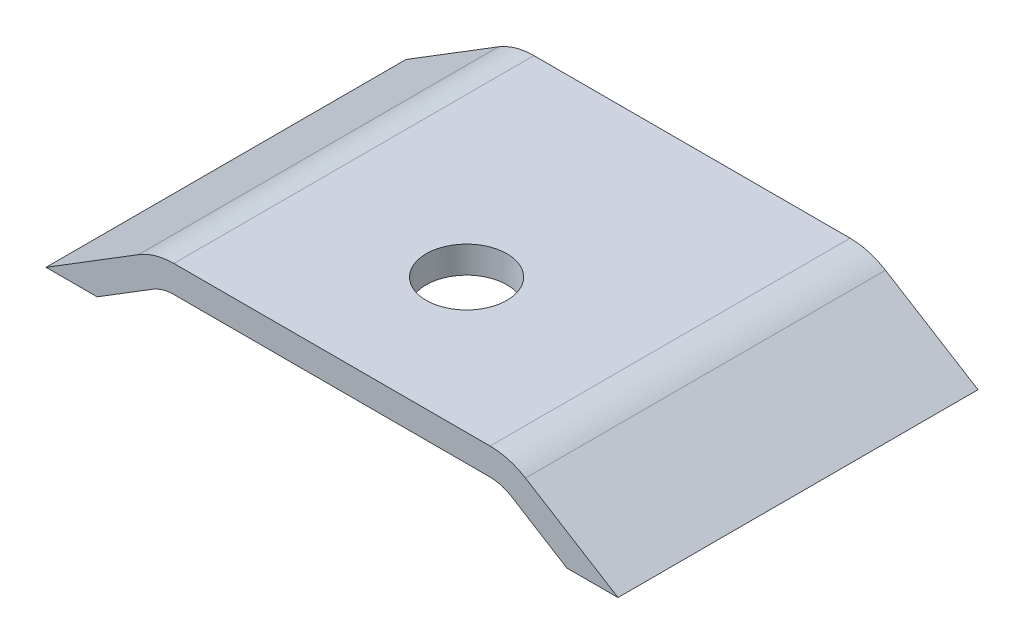
ISO-10303-21;
HEADER;
FILE_DESCRIPTION(('STEP AP214'),'2;1');
FILE_NAME('part.step','',(''),(''),'','','');
FILE_SCHEMA(('AUTOMOTIVE_DESIGN { 1 0 10303 214 1 1 1 1 }'));
ENDSEC;
DATA;
#1=APPLICATION_CONTEXT('core data for automotive mechanical design processes');
#2=APPLICATION_PROTOCOL_DEFINITION('international standard','automotive_design',2000,#1);
#3=PRODUCT_CONTEXT('',#1,'mechanical');
#4=PRODUCT('Part','Part','',(#3));
#5=PRODUCT_RELATED_PRODUCT_CATEGORY('part','',(#4));
#6=PRODUCT_DEFINITION_FORMATION('','',#4);
#7=PRODUCT_DEFINITION_CONTEXT('part definition',#1,'design');
#8=PRODUCT_DEFINITION('design','',#6,#7);
#9=PRODUCT_DEFINITION_SHAPE('','',#8);
#10=(LENGTH_UNIT() NAMED_UNIT(*) SI_UNIT(.MILLI.,.METRE.));
#11=(NAMED_UNIT(*) PLANE_ANGLE_UNIT() SI_UNIT($,.RADIAN.));
#12=(NAMED_UNIT(*) SI_UNIT($,.STERADIAN.) SOLID_ANGLE_UNIT());
#13=UNCERTAINTY_MEASURE_WITH_UNIT(LENGTH_MEASURE(1.E-05),#10,'distance_accuracy_value','');
#14=(GEOMETRIC_REPRESENTATION_CONTEXT(3) GLOBAL_UNCERTAINTY_ASSIGNED_CONTEXT((#13)) GLOBAL_UNIT_ASSIGNED_CONTEXT((#10,
#11,#12)) REPRESENTATION_CONTEXT('',''));
#15=CARTESIAN_POINT('',(0.,0.,0.));
#16=DIRECTION('',(0.,0.,1.));
#17=DIRECTION('',(1.,0.,0.));
#18=AXIS2_PLACEMENT_3D('',#15,#16,#17);
#19=CARTESIAN_POINT('',(53.975,-6.34999999999999,67.945));
#20=DIRECTION('',(0.,1.,0.));
#21=DIRECTION('',(-1.,0.,0.));
#22=AXIS2_PLACEMENT_3D('',#19,#20,#21);
#23=PLANE('',#22);
#24=DIRECTION('',(1.,0.,0.));
#25=VECTOR('',#24,1.);
#26=CARTESIAN_POINT('',(53.975,-6.34999999999999,67.945));
#27=LINE('',#26,#25);
#28=CARTESIAN_POINT('',(44.3202396465514,-6.34999999999999,67.945));
#29=VERTEX_POINT('',#28);
#30=CARTESIAN_POINT('',(53.975,-6.34999999999999,67.945));
#31=VERTEX_POINT('',#30);
#32=EDGE_CURVE('E155',#29,#31,#27,.T.);
#33=ORIENTED_EDGE('',*,*,#32,.F.);
#34=DIRECTION('',(0.,0.,1.));
#35=VECTOR('',#34,1.);
#36=CARTESIAN_POINT('',(44.3202396465514,-6.35,-0.001000000000001));
#37=LINE('',#36,#35);
#38=CARTESIAN_POINT('',(44.3202396465514,-6.35000000000001,0.));
#39=VERTEX_POINT('',#38);
#40=EDGE_CURVE('E146',#39,#29,#37,.T.);
#41=ORIENTED_EDGE('',*,*,#40,.F.);
#42=DIRECTION('',(1.,0.,0.));
#43=VECTOR('',#42,1.);
#44=CARTESIAN_POINT('',(53.975,-6.34999999999999,0.));
#45=LINE('',#44,#43);
#46=CARTESIAN_POINT('',(53.975,-6.34999999999999,0.));
#47=VERTEX_POINT('',#46);
#48=EDGE_CURVE('E170',#39,#47,#45,.T.);
#49=ORIENTED_EDGE('',*,*,#48,.T.);
#50=DIRECTION('',(0.,0.,-1.));
#51=VECTOR('',#50,1.);
#52=CARTESIAN_POINT('',(53.975,-6.34999999999999,67.945));
#53=LINE('',#52,#51);
#54=EDGE_CURVE('E177',#31,#47,#53,.T.);
#55=ORIENTED_EDGE('',*,*,#54,.F.);
#56=EDGE_LOOP('',(#33,#41,#49,#55));
#57=FACE_BOUND('',#56,.T.);
#58=ADVANCED_FACE('F36',(#57),#23,.F.);
#59=CARTESIAN_POINT('',(-53.975,-6.35000000000001,0.));
#60=VERTEX_POINT('',#59);
#61=CARTESIAN_POINT('',(-44.3202396465514,-6.35000000000001,0.));
#62=VERTEX_POINT('',#61);
#63=EDGE_CURVE('E145',#60,#62,#45,.T.);
#64=ORIENTED_EDGE('',*,*,#63,.T.);
#65=DIRECTION('',(0.,0.,-1.));
#66=VECTOR('',#65,1.);
#67=CARTESIAN_POINT('',(-44.3202396465514,-6.35000000000001,-0.001000000000001));
#68=LINE('',#67,#66);
#69=CARTESIAN_POINT('',(-44.3202396465514,-6.35000000000001,67.945));
#70=VERTEX_POINT('',#69);
#71=EDGE_CURVE('E128',#70,#62,#68,.T.);
#72=ORIENTED_EDGE('',*,*,#71,.F.);
#73=CARTESIAN_POINT('',(-53.975,-6.35000000000001,67.945));
#74=VERTEX_POINT('',#73);
#75=EDGE_CURVE('E143',#74,#70,#27,.T.);
#76=ORIENTED_EDGE('',*,*,#75,.F.);
#77=DIRECTION('',(0.,0.,-1.));
#78=VECTOR('',#77,1.);
#79=CARTESIAN_POINT('',(-53.975,-6.35000000000001,67.945));
#80=LINE('',#79,#78);
#81=EDGE_CURVE('E167',#74,#60,#80,.T.);
#82=ORIENTED_EDGE('',*,*,#81,.T.);
#83=EDGE_LOOP('',(#64,#72,#76,#82));
#84=FACE_BOUND('',#83,.T.);
#85=ADVANCED_FACE('F141',(#84),#23,.F.);
#86=CARTESIAN_POINT('',(33.4494066038088,6.35,67.945));
#87=DIRECTION('',(-0.526165312656928,-0.850382304470546,0.));
#88=DIRECTION('',(0.850382304470546,-0.526165312656929,0.));
#89=AXIS2_PLACEMENT_3D('',#86,#87,#88);
#90=PLANE('',#89);
#91=DIRECTION('',(-0.850382304470546,0.526165312656928,0.));
#92=VECTOR('',#91,1.);
#93=CARTESIAN_POINT('',(33.4494066038088,6.35,0.));
#94=LINE('',#93,#92);
#95=CARTESIAN_POINT('',(36.5203985871215,4.44985526677593,0.));
#96=VERTEX_POINT('',#95);
#97=EDGE_CURVE('E169',#47,#96,#94,.T.);
#98=ORIENTED_EDGE('',*,*,#97,.T.);
#99=DIRECTION('',(0.,0.,-1.));
#100=VECTOR('',#99,1.);
#101=CARTESIAN_POINT('',(36.5203985871215,4.44985526677593,67.945));
#102=LINE('',#101,#100);
#103=CARTESIAN_POINT('',(36.5203985871215,4.44985526677593,67.945));
#104=VERTEX_POINT('',#103);
#105=EDGE_CURVE('E11',#96,#104,#102,.F.);
#106=ORIENTED_EDGE('',*,*,#105,.T.);
#107=DIRECTION('',(-0.850382304470546,0.526165312656928,0.));
#108=VECTOR('',#107,1.);
#109=CARTESIAN_POINT('',(33.4494066038088,6.35,67.945));
#110=LINE('',#109,#108);
#111=EDGE_CURVE('E154',#31,#104,#110,.T.);
#112=ORIENTED_EDGE('',*,*,#111,.F.);
#113=ORIENTED_EDGE('',*,*,#54,.T.);
#114=EDGE_LOOP('',(#98,#106,#112,#113));
#115=FACE_BOUND('',#114,.T.);
#116=ADVANCED_FACE('F213',(#115),#90,.F.);
#117=CARTESIAN_POINT('',(-33.4494066038088,6.34999999999999,67.945));
#118=DIRECTION('',(0.,-1.,0.));
#119=DIRECTION('',(1.,0.,0.));
#120=AXIS2_PLACEMENT_3D('',#117,#118,#119);
#121=PLANE('',#120);
#122=CARTESIAN_POINT('',(0.,6.35,42.545));
#123=DIRECTION('',(0.,1.,0.));
#124=DIRECTION('',(-1.,0.,0.));
#125=AXIS2_PLACEMENT_3D('',#122,#123,#124);
#126=CIRCLE('',#125,7.62);
#127=CARTESIAN_POINT('',(-7.62,6.35,42.545));
#128=VERTEX_POINT('',#127);
#129=EDGE_CURVE('E287',#128,#128,#126,.T.);
#130=ORIENTED_EDGE('',*,*,#129,.F.);
#131=EDGE_LOOP('',(#130));
#132=FACE_BOUND('',#131,.T.);
#133=DIRECTION('',(-1.,0.,0.));
#134=VECTOR('',#133,1.);
#135=CARTESIAN_POINT('',(-33.4494066038088,6.34999999999999,0.));
#136=LINE('',#135,#134);
#137=CARTESIAN_POINT('',(29.8380991163785,6.35,0.));
#138=VERTEX_POINT('',#137);
#139=CARTESIAN_POINT('',(-29.8380991163785,6.34999999999999,0.));
#140=VERTEX_POINT('',#139);
#141=EDGE_CURVE('E172',#138,#140,#136,.T.);
#142=ORIENTED_EDGE('',*,*,#141,.T.);
#143=DIRECTION('',(0.,0.,-1.));
#144=VECTOR('',#143,1.);
#145=CARTESIAN_POINT('',(-29.8380991163785,6.34999999999999,67.945));
#146=LINE('',#145,#144);
#147=CARTESIAN_POINT('',(-29.8380991163785,6.34999999999999,67.945));
#148=VERTEX_POINT('',#147);
#149=EDGE_CURVE('E190',#140,#148,#146,.F.);
#150=ORIENTED_EDGE('',*,*,#149,.T.);
#151=DIRECTION('',(-1.,0.,0.));
#152=VECTOR('',#151,1.);
#153=CARTESIAN_POINT('',(-33.4494066038088,6.34999999999999,67.945));
#154=LINE('',#153,#152);
#155=CARTESIAN_POINT('',(29.8380991163785,6.35,67.945));
#156=VERTEX_POINT('',#155);
#157=EDGE_CURVE('E157',#156,#148,#154,.T.);
#158=ORIENTED_EDGE('',*,*,#157,.F.);
#159=DIRECTION('',(0.,0.,-1.));
#160=VECTOR('',#159,1.);
#161=CARTESIAN_POINT('',(29.8380991163785,6.35,67.945));
#162=LINE('',#161,#160);
#163=EDGE_CURVE('E187',#156,#138,#162,.T.);
#164=ORIENTED_EDGE('',*,*,#163,.T.);
#165=EDGE_LOOP('',(#142,#150,#158,#164));
#166=FACE_BOUND('',#165,.T.);
#167=ADVANCED_FACE('F207',(#132,#166),#121,.F.);
#168=CARTESIAN_POINT('',(-53.975,-6.35000000000001,67.945));
#169=DIRECTION('',(0.526165312656929,-0.850382304470546,0.));
#170=DIRECTION('',(0.850382304470546,0.526165312656929,0.));
#171=AXIS2_PLACEMENT_3D('',#168,#169,#170);
#172=PLANE('',#171);
#173=DIRECTION('',(-0.850382304470546,-0.526165312656929,0.));
#174=VECTOR('',#173,1.);
#175=CARTESIAN_POINT('',(-53.975,-6.35000000000001,67.945));
#176=LINE('',#175,#174);
#177=CARTESIAN_POINT('',(-36.5203985871215,4.44985526677593,67.945));
#178=VERTEX_POINT('',#177);
#179=EDGE_CURVE('E152',#178,#74,#176,.T.);
#180=ORIENTED_EDGE('',*,*,#179,.F.);
#181=DIRECTION('',(0.,0.,-1.));
#182=VECTOR('',#181,1.);
#183=CARTESIAN_POINT('',(-36.5203985871215,4.44985526677593,67.945));
#184=LINE('',#183,#182);
#185=CARTESIAN_POINT('',(-36.5203985871215,4.44985526677593,0.));
#186=VERTEX_POINT('',#185);
#187=EDGE_CURVE('E180',#178,#186,#184,.T.);
#188=ORIENTED_EDGE('',*,*,#187,.T.);
#189=DIRECTION('',(-0.850382304470546,-0.526165312656929,0.));
#190=VECTOR('',#189,1.);
#191=CARTESIAN_POINT('',(-53.975,-6.35000000000001,0.));
#192=LINE('',#191,#190);
#193=EDGE_CURVE('E159',#186,#60,#192,.T.);
#194=ORIENTED_EDGE('',*,*,#193,.T.);
#195=ORIENTED_EDGE('',*,*,#81,.F.);
#196=EDGE_LOOP('',(#180,#188,#194,#195));
#197=FACE_BOUND('',#196,.T.);
#198=ADVANCED_FACE('F199',(#197),#172,.F.);
#199=CARTESIAN_POINT('',(0.,0.,67.945));
#200=DIRECTION('',(0.,0.,-1.));
#201=DIRECTION('',(-1.,0.,0.));
#202=AXIS2_PLACEMENT_3D('',#199,#200,#201);
#203=PLANE('',#202);
#204=CARTESIAN_POINT('',(29.8380991163785,-6.35,67.945));
#205=DIRECTION('',(0.,0.,1.));
#206=DIRECTION('',(1.,0.,0.));
#207=AXIS2_PLACEMENT_3D('',#204,#205,#206);
#208=CIRCLE('',#207,7.62);
#209=CARTESIAN_POINT('',(33.8474787988243,0.129913160065561,67.945));
#210=VERTEX_POINT('',#209);
#211=CARTESIAN_POINT('',(29.8380991163785,1.27,67.945));
#212=VERTEX_POINT('',#211);
#213=EDGE_CURVE('E230',#210,#212,#208,.T.);
#214=ORIENTED_EDGE('',*,*,#213,.F.);
#215=DIRECTION('',(-0.850382304470546,0.526165312656929,0.));
#216=VECTOR('',#215,1.);
#217=CARTESIAN_POINT('',(51.3020802117028,-10.6699421067104,67.945));
#218=LINE('',#217,#216);
#219=EDGE_CURVE('E234',#29,#210,#218,.T.);
#220=ORIENTED_EDGE('',*,*,#219,.F.);
#221=ORIENTED_EDGE('',*,*,#32,.T.);
#222=ORIENTED_EDGE('',*,*,#111,.T.);
#223=CARTESIAN_POINT('',(29.8380991163785,-6.35,67.945));
#224=DIRECTION('',(0.,0.,-1.));
#225=DIRECTION('',(-1.,0.,0.));
#226=AXIS2_PLACEMENT_3D('',#223,#224,#225);
#227=CIRCLE('',#226,12.7);
#228=EDGE_CURVE('E192',#104,#156,#227,.F.);
#229=ORIENTED_EDGE('',*,*,#228,.T.);
#230=ORIENTED_EDGE('',*,*,#157,.T.);
#231=CARTESIAN_POINT('',(-29.8380991163785,-6.35,67.945));
#232=DIRECTION('',(0.,0.,-1.));
#233=DIRECTION('',(-1.,0.,0.));
#234=AXIS2_PLACEMENT_3D('',#231,#232,#233);
#235=CIRCLE('',#234,12.7);
#236=EDGE_CURVE('E44',#148,#178,#235,.F.);
#237=ORIENTED_EDGE('',*,*,#236,.T.);
#238=ORIENTED_EDGE('',*,*,#179,.T.);
#239=ORIENTED_EDGE('',*,*,#75,.T.);
#240=DIRECTION('',(-0.850382304470546,-0.526165312656929,0.));
#241=VECTOR('',#240,1.);
#242=CARTESIAN_POINT('',(-33.8474787988243,0.129913160065554,67.945));
#243=LINE('',#242,#241);
#244=CARTESIAN_POINT('',(-33.8474787988243,0.129913160065554,67.945));
#245=VERTEX_POINT('',#244);
#246=EDGE_CURVE('E124',#245,#70,#243,.T.);
#247=ORIENTED_EDGE('',*,*,#246,.F.);
#248=CARTESIAN_POINT('',(-29.8380991163785,-6.35,67.945));
#249=DIRECTION('',(0.,0.,1.));
#250=DIRECTION('',(1.,0.,0.));
#251=AXIS2_PLACEMENT_3D('',#248,#249,#250);
#252=CIRCLE('',#251,7.62);
#253=CARTESIAN_POINT('',(-29.8380991163785,1.26999999999999,67.945));
#254=VERTEX_POINT('',#253);
#255=EDGE_CURVE('E136',#254,#245,#252,.T.);
#256=ORIENTED_EDGE('',*,*,#255,.F.);
#257=DIRECTION('',(-1.,0.,0.));
#258=VECTOR('',#257,1.);
#259=CARTESIAN_POINT('',(29.8380991163785,1.27,67.945));
#260=LINE('',#259,#258);
#261=EDGE_CURVE('E239',#212,#254,#260,.T.);
#262=ORIENTED_EDGE('',*,*,#261,.F.);
#263=EDGE_LOOP('',(#214,#220,#221,#222,#229,#230,#237,#238,#239,#247,#256,#262));
#264=FACE_BOUND('',#263,.T.);
#265=ADVANCED_FACE('F150',(#264),#203,.F.);
#266=CARTESIAN_POINT('',(0.,0.,0.));
#267=DIRECTION('',(0.,0.,-1.));
#268=DIRECTION('',(-1.,0.,0.));
#269=AXIS2_PLACEMENT_3D('',#266,#267,#268);
#270=PLANE('',#269);
#271=DIRECTION('',(-0.850382304470546,0.526165312656929,0.));
#272=VECTOR('',#271,1.);
#273=CARTESIAN_POINT('',(51.3020802117028,-10.6699421067104,0.));
#274=LINE('',#273,#272);
#275=CARTESIAN_POINT('',(33.8474787988243,0.129913160065561,0.));
#276=VERTEX_POINT('',#275);
#277=EDGE_CURVE('E236',#39,#276,#274,.T.);
#278=ORIENTED_EDGE('',*,*,#277,.T.);
#279=CARTESIAN_POINT('',(29.8380991163785,-6.35,0.));
#280=DIRECTION('',(0.,0.,-1.));
#281=DIRECTION('',(-1.,0.,0.));
#282=AXIS2_PLACEMENT_3D('',#279,#280,#281);
#283=CIRCLE('',#282,7.62);
#284=CARTESIAN_POINT('',(29.8380991163785,1.27,0.));
#285=VERTEX_POINT('',#284);
#286=EDGE_CURVE('E161',#276,#285,#283,.F.);
#287=ORIENTED_EDGE('',*,*,#286,.T.);
#288=DIRECTION('',(-1.,0.,0.));
#289=VECTOR('',#288,1.);
#290=CARTESIAN_POINT('',(29.8380991163785,1.27,0.));
#291=LINE('',#290,#289);
#292=CARTESIAN_POINT('',(-29.8380991163785,1.26999999999999,0.));
#293=VERTEX_POINT('',#292);
#294=EDGE_CURVE('E51',#285,#293,#291,.T.);
#295=ORIENTED_EDGE('',*,*,#294,.T.);
#296=CARTESIAN_POINT('',(-29.8380991163785,-6.35,0.));
#297=DIRECTION('',(0.,0.,-1.));
#298=DIRECTION('',(-1.,0.,0.));
#299=AXIS2_PLACEMENT_3D('',#296,#297,#298);
#300=CIRCLE('',#299,7.62);
#301=CARTESIAN_POINT('',(-33.8474787988243,0.129913160065554,0.));
#302=VERTEX_POINT('',#301);
#303=EDGE_CURVE('E247',#293,#302,#300,.F.);
#304=ORIENTED_EDGE('',*,*,#303,.T.);
#305=DIRECTION('',(-0.850382304470546,-0.526165312656929,0.));
#306=VECTOR('',#305,1.);
#307=CARTESIAN_POINT('',(-33.8474787988243,0.129913160065554,0.));
#308=LINE('',#307,#306);
#309=EDGE_CURVE('E296',#302,#62,#308,.T.);
#310=ORIENTED_EDGE('',*,*,#309,.T.);
#311=ORIENTED_EDGE('',*,*,#63,.F.);
#312=ORIENTED_EDGE('',*,*,#193,.F.);
#313=CARTESIAN_POINT('',(-29.8380991163785,-6.35,0.));
#314=DIRECTION('',(0.,0.,-1.));
#315=DIRECTION('',(-1.,0.,0.));
#316=AXIS2_PLACEMENT_3D('',#313,#314,#315);
#317=CIRCLE('',#316,12.7);
#318=EDGE_CURVE('E185',#186,#140,#317,.T.);
#319=ORIENTED_EDGE('',*,*,#318,.T.);
#320=ORIENTED_EDGE('',*,*,#141,.F.);
#321=CARTESIAN_POINT('',(29.8380991163785,-6.35,0.));
#322=DIRECTION('',(0.,0.,-1.));
#323=DIRECTION('',(-1.,0.,0.));
#324=AXIS2_PLACEMENT_3D('',#321,#322,#323);
#325=CIRCLE('',#324,12.7);
#326=EDGE_CURVE('E183',#138,#96,#325,.T.);
#327=ORIENTED_EDGE('',*,*,#326,.T.);
#328=ORIENTED_EDGE('',*,*,#97,.F.);
#329=ORIENTED_EDGE('',*,*,#48,.F.);
#330=EDGE_LOOP('',(#278,#287,#295,#304,#310,#311,#312,#319,#320,#327,#328,#329));
#331=FACE_BOUND('',#330,.T.);
#332=ADVANCED_FACE('F205',(#331),#270,.T.);
#333=CARTESIAN_POINT('',(-29.8380991163785,-6.35,67.945));
#334=DIRECTION('',(0.,0.,-1.));
#335=DIRECTION('',(-1.,0.,0.));
#336=AXIS2_PLACEMENT_3D('',#333,#334,#335);
#337=CYLINDRICAL_SURFACE('',#336,12.7);
#338=ORIENTED_EDGE('',*,*,#236,.F.);
#339=ORIENTED_EDGE('',*,*,#149,.F.);
#340=ORIENTED_EDGE('',*,*,#318,.F.);
#341=ORIENTED_EDGE('',*,*,#187,.F.);
#342=EDGE_LOOP('',(#338,#339,#340,#341));
#343=FACE_BOUND('',#342,.T.);
#344=ADVANCED_FACE('F201',(#343),#337,.T.);
#345=CARTESIAN_POINT('',(29.8380991163785,-6.35,67.945));
#346=DIRECTION('',(0.,0.,-1.));
#347=DIRECTION('',(-1.,0.,0.));
#348=AXIS2_PLACEMENT_3D('',#345,#346,#347);
#349=CYLINDRICAL_SURFACE('',#348,12.7);
#350=ORIENTED_EDGE('',*,*,#228,.F.);
#351=ORIENTED_EDGE('',*,*,#105,.F.);
#352=ORIENTED_EDGE('',*,*,#326,.F.);
#353=ORIENTED_EDGE('',*,*,#163,.F.);
#354=EDGE_LOOP('',(#350,#351,#352,#353));
#355=FACE_BOUND('',#354,.T.);
#356=ADVANCED_FACE('F38',(#355),#349,.T.);
#357=CARTESIAN_POINT('',(51.3020802117028,-10.6699421067104,-0.001000000000001));
#358=DIRECTION('',(0.526165312656929,0.850382304470546,0.));
#359=DIRECTION('',(-0.850382304470546,0.526165312656929,0.));
#360=AXIS2_PLACEMENT_3D('',#357,#358,#359);
#361=PLANE('',#360);
#362=ORIENTED_EDGE('',*,*,#40,.T.);
#363=ORIENTED_EDGE('',*,*,#219,.T.);
#364=DIRECTION('',(0.,0.,1.));
#365=VECTOR('',#364,1.);
#366=CARTESIAN_POINT('',(33.8474787988243,0.129913160065561,-0.001000000000001));
#367=LINE('',#366,#365);
#368=EDGE_CURVE('E135',#276,#210,#367,.T.);
#369=ORIENTED_EDGE('',*,*,#368,.F.);
#370=ORIENTED_EDGE('',*,*,#277,.F.);
#371=EDGE_LOOP('',(#362,#363,#369,#370));
#372=FACE_BOUND('',#371,.T.);
#373=ADVANCED_FACE('F235',(#372),#361,.F.);
#374=CARTESIAN_POINT('',(-33.8474787988243,0.129913160065554,-0.001000000000001));
#375=DIRECTION('',(-0.526165312656929,0.850382304470546,0.));
#376=DIRECTION('',(-0.850382304470546,-0.526165312656929,0.));
#377=AXIS2_PLACEMENT_3D('',#374,#375,#376);
#378=PLANE('',#377);
#379=ORIENTED_EDGE('',*,*,#71,.T.);
#380=ORIENTED_EDGE('',*,*,#309,.F.);
#381=DIRECTION('',(0.,0.,1.));
#382=VECTOR('',#381,1.);
#383=CARTESIAN_POINT('',(-33.8474787988243,0.129913160065554,-0.001000000000001));
#384=LINE('',#383,#382);
#385=EDGE_CURVE('E130',#302,#245,#384,.T.);
#386=ORIENTED_EDGE('',*,*,#385,.T.);
#387=ORIENTED_EDGE('',*,*,#246,.T.);
#388=EDGE_LOOP('',(#379,#380,#386,#387));
#389=FACE_BOUND('',#388,.T.);
#390=ADVANCED_FACE('F126',(#389),#378,.F.);
#391=CARTESIAN_POINT('',(-29.8380991163785,-6.35,-0.001000000000001));
#392=DIRECTION('',(0.,0.,1.));
#393=DIRECTION('',(1.,0.,0.));
#394=AXIS2_PLACEMENT_3D('',#391,#392,#393);
#395=CYLINDRICAL_SURFACE('',#394,7.62);
#396=DIRECTION('',(0.,0.,1.));
#397=VECTOR('',#396,1.);
#398=CARTESIAN_POINT('',(-29.8380991163785,1.26999999999999,-0.001000000000001));
#399=LINE('',#398,#397);
#400=EDGE_CURVE('E220',#293,#254,#399,.T.);
#401=ORIENTED_EDGE('',*,*,#400,.T.);
#402=ORIENTED_EDGE('',*,*,#255,.T.);
#403=ORIENTED_EDGE('',*,*,#385,.F.);
#404=ORIENTED_EDGE('',*,*,#303,.F.);
#405=EDGE_LOOP('',(#401,#402,#403,#404));
#406=FACE_BOUND('',#405,.T.);
#407=ADVANCED_FACE('F244',(#406),#395,.F.);
#408=CARTESIAN_POINT('',(29.8380991163785,1.27,-0.001000000000001));
#409=DIRECTION('',(0.,1.,0.));
#410=DIRECTION('',(-1.,0.,0.));
#411=AXIS2_PLACEMENT_3D('',#408,#409,#410);
#412=PLANE('',#411);
#413=CARTESIAN_POINT('',(0.,1.27,42.545));
#414=DIRECTION('',(0.,1.,0.));
#415=DIRECTION('',(-1.,0.,0.));
#416=AXIS2_PLACEMENT_3D('',#413,#414,#415);
#417=CIRCLE('',#416,7.62);
#418=CARTESIAN_POINT('',(-7.62,1.27,42.545));
#419=VERTEX_POINT('',#418);
#420=EDGE_CURVE('E147',#419,#419,#417,.F.);
#421=ORIENTED_EDGE('',*,*,#420,.F.);
#422=EDGE_LOOP('',(#421));
#423=FACE_BOUND('',#422,.T.);
#424=DIRECTION('',(0.,0.,1.));
#425=VECTOR('',#424,1.);
#426=CARTESIAN_POINT('',(29.8380991163785,1.27,-0.001000000000001));
#427=LINE('',#426,#425);
#428=EDGE_CURVE('E222',#285,#212,#427,.T.);
#429=ORIENTED_EDGE('',*,*,#428,.T.);
#430=ORIENTED_EDGE('',*,*,#261,.T.);
#431=ORIENTED_EDGE('',*,*,#400,.F.);
#432=ORIENTED_EDGE('',*,*,#294,.F.);
#433=EDGE_LOOP('',(#429,#430,#431,#432));
#434=FACE_BOUND('',#433,.T.);
#435=ADVANCED_FACE('F248',(#423,#434),#412,.F.);
#436=CARTESIAN_POINT('',(29.8380991163785,-6.35,-0.001000000000001));
#437=DIRECTION('',(0.,0.,1.));
#438=DIRECTION('',(1.,0.,0.));
#439=AXIS2_PLACEMENT_3D('',#436,#437,#438);
#440=CYLINDRICAL_SURFACE('',#439,7.62);
#441=ORIENTED_EDGE('',*,*,#368,.T.);
#442=ORIENTED_EDGE('',*,*,#213,.T.);
#443=ORIENTED_EDGE('',*,*,#428,.F.);
#444=ORIENTED_EDGE('',*,*,#286,.F.);
#445=EDGE_LOOP('',(#441,#442,#443,#444));
#446=FACE_BOUND('',#445,.T.);
#447=ADVANCED_FACE('F229',(#446),#440,.F.);
#448=CARTESIAN_POINT('',(0.,-6.35100000000002,42.545));
#449=DIRECTION('',(0.,1.,0.));
#450=DIRECTION('',(-1.,0.,0.));
#451=AXIS2_PLACEMENT_3D('',#448,#449,#450);
#452=CYLINDRICAL_SURFACE('',#451,7.62);
#453=ORIENTED_EDGE('',*,*,#129,.T.);
#454=EDGE_LOOP('',(#453));
#455=FACE_BOUND('',#454,.T.);
#456=ORIENTED_EDGE('',*,*,#420,.T.);
#457=EDGE_LOOP('',(#456));
#458=FACE_BOUND('',#457,.T.);
#459=ADVANCED_FACE('F256',(#455,#458),#452,.F.);
#460=CLOSED_SHELL('',(#58,#85,#116,#167,#198,#265,#332,#344,#356,#373,#390,#407,#435,#447,#459));
#461=MANIFOLD_SOLID_BREP('B2',#460);
#462=ADVANCED_BREP_SHAPE_REPRESENTATION('',(#18,#461),#14);
#463=SHAPE_DEFINITION_REPRESENTATION(#9,#462);
ENDSEC;
END-ISO-10303-21;
